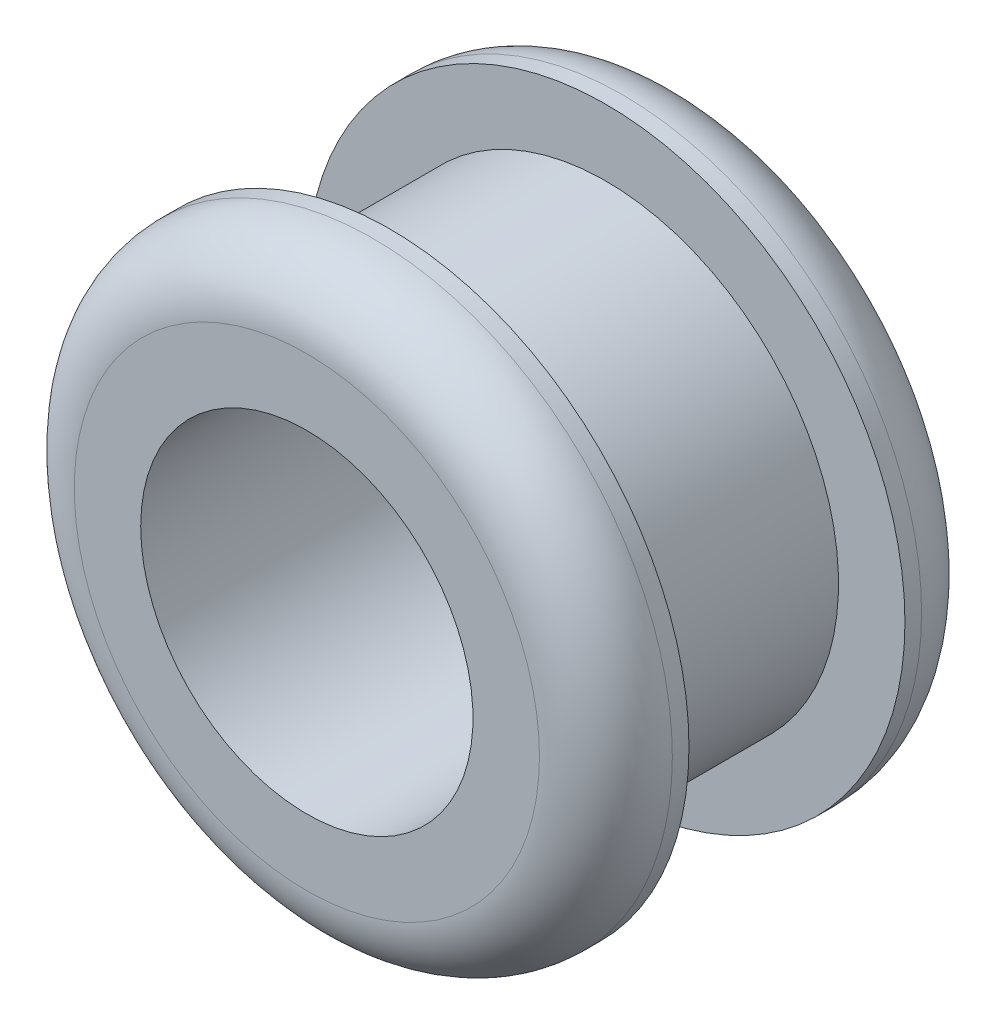
ISO-10303-21;
HEADER;
FILE_DESCRIPTION(('STEP AP214'),'2;1');
FILE_NAME('part.step','',(''),(''),'','','');
FILE_SCHEMA(('AUTOMOTIVE_DESIGN { 1 0 10303 214 1 1 1 1 }'));
ENDSEC;
DATA;
#1=APPLICATION_CONTEXT('core data for automotive mechanical design processes');
#2=APPLICATION_PROTOCOL_DEFINITION('international standard','automotive_design',2000,#1);
#3=PRODUCT_CONTEXT('',#1,'mechanical');
#4=PRODUCT('Part','Part','',(#3));
#5=PRODUCT_RELATED_PRODUCT_CATEGORY('part','',(#4));
#6=PRODUCT_DEFINITION_FORMATION('','',#4);
#7=PRODUCT_DEFINITION_CONTEXT('part definition',#1,'design');
#8=PRODUCT_DEFINITION('design','',#6,#7);
#9=PRODUCT_DEFINITION_SHAPE('','',#8);
#10=(LENGTH_UNIT() NAMED_UNIT(*) SI_UNIT(.MILLI.,.METRE.));
#11=(NAMED_UNIT(*) PLANE_ANGLE_UNIT() SI_UNIT($,.RADIAN.));
#12=(NAMED_UNIT(*) SI_UNIT($,.STERADIAN.) SOLID_ANGLE_UNIT());
#13=UNCERTAINTY_MEASURE_WITH_UNIT(LENGTH_MEASURE(1.E-05),#10,'distance_accuracy_value','');
#14=(GEOMETRIC_REPRESENTATION_CONTEXT(3) GLOBAL_UNCERTAINTY_ASSIGNED_CONTEXT((#13)) GLOBAL_UNIT_ASSIGNED_CONTEXT((#10,
#11,#12)) REPRESENTATION_CONTEXT('',''));
#15=CARTESIAN_POINT('',(0.,0.,0.));
#16=DIRECTION('',(0.,0.,1.));
#17=DIRECTION('',(1.,0.,0.));
#18=AXIS2_PLACEMENT_3D('',#15,#16,#17);
#19=CARTESIAN_POINT('',(0.,0.,3.25));
#20=DIRECTION('',(0.,0.,-1.));
#21=DIRECTION('',(-1.,0.,0.));
#22=AXIS2_PLACEMENT_3D('',#19,#20,#21);
#23=CYLINDRICAL_SURFACE('',#22,7.);
#24=CARTESIAN_POINT('',(0.,0.,3.25));
#25=DIRECTION('',(0.,0.,1.));
#26=DIRECTION('',(1.,0.,0.));
#27=AXIS2_PLACEMENT_3D('',#24,#25,#26);
#28=CIRCLE('',#27,7.);
#29=CARTESIAN_POINT('',(-7.,0.,3.25));
#30=VERTEX_POINT('',#29);
#31=EDGE_CURVE('E55',#30,#30,#28,.T.);
#32=CARTESIAN_POINT('',(0.,0.,-3.25));
#33=DIRECTION('',(0.,0.,1.));
#34=DIRECTION('',(1.,0.,0.));
#35=AXIS2_PLACEMENT_3D('',#32,#33,#34);
#36=CIRCLE('',#35,7.);
#37=CARTESIAN_POINT('',(-7.,0.,-3.25));
#38=VERTEX_POINT('',#37);
#39=EDGE_CURVE('E56',#38,#38,#36,.T.);
#40=CARTESIAN_POINT('',(-7.,0.,3.25));
#41=CARTESIAN_POINT('',(-7.,0.,3.18229166666667));
#42=CARTESIAN_POINT('',(-7.,0.,3.11458333333333));
#43=CARTESIAN_POINT('',(-7.,0.,2.97916666666667));
#44=CARTESIAN_POINT('',(-7.,0.,2.91145833333333));
#45=CARTESIAN_POINT('',(-7.,0.,2.77604166666667));
#46=CARTESIAN_POINT('',(-7.,0.,2.70833333333333));
#47=CARTESIAN_POINT('',(-7.,0.,2.57291666666667));
#48=CARTESIAN_POINT('',(-7.,0.,2.50520833333333));
#49=CARTESIAN_POINT('',(-7.,0.,2.36979166666667));
#50=CARTESIAN_POINT('',(-7.,0.,2.30208333333333));
#51=CARTESIAN_POINT('',(-7.,0.,2.16666666666667));
#52=CARTESIAN_POINT('',(-7.,0.,2.09895833333333));
#53=CARTESIAN_POINT('',(-7.,0.,1.96354166666667));
#54=CARTESIAN_POINT('',(-7.,0.,1.89583333333333));
#55=CARTESIAN_POINT('',(-7.,0.,1.76041666666667));
#56=CARTESIAN_POINT('',(-7.,0.,1.69270833333333));
#57=CARTESIAN_POINT('',(-7.,0.,1.55729166666667));
#58=CARTESIAN_POINT('',(-7.,0.,1.48958333333333));
#59=CARTESIAN_POINT('',(-7.,0.,1.35416666666667));
#60=CARTESIAN_POINT('',(-7.,0.,1.28645833333333));
#61=CARTESIAN_POINT('',(-7.,0.,1.15104166666667));
#62=CARTESIAN_POINT('',(-7.,0.,1.08333333333333));
#63=CARTESIAN_POINT('',(-7.,0.,0.947916666666667));
#64=CARTESIAN_POINT('',(-7.,0.,0.880208333333333));
#65=CARTESIAN_POINT('',(-7.,0.,0.744791666666667));
#66=CARTESIAN_POINT('',(-7.,0.,0.677083333333333));
#67=CARTESIAN_POINT('',(-7.,0.,0.541666666666667));
#68=CARTESIAN_POINT('',(-7.,0.,0.473958333333333));
#69=CARTESIAN_POINT('',(-7.,0.,0.338541666666667));
#70=CARTESIAN_POINT('',(-7.,0.,0.270833333333333));
#71=CARTESIAN_POINT('',(-7.,0.,0.135416666666667));
#72=CARTESIAN_POINT('',(-7.,0.,0.0677083333333334));
#73=CARTESIAN_POINT('',(-7.,0.,-0.0677083333333334));
#74=CARTESIAN_POINT('',(-7.,0.,-0.135416666666667));
#75=CARTESIAN_POINT('',(-7.,0.,-0.270833333333333));
#76=CARTESIAN_POINT('',(-7.,0.,-0.338541666666667));
#77=CARTESIAN_POINT('',(-7.,0.,-0.473958333333333));
#78=CARTESIAN_POINT('',(-7.,0.,-0.541666666666667));
#79=CARTESIAN_POINT('',(-7.,0.,-0.677083333333333));
#80=CARTESIAN_POINT('',(-7.,0.,-0.744791666666666));
#81=CARTESIAN_POINT('',(-7.,0.,-0.880208333333333));
#82=CARTESIAN_POINT('',(-7.,0.,-0.947916666666666));
#83=CARTESIAN_POINT('',(-7.,0.,-1.08333333333333));
#84=CARTESIAN_POINT('',(-7.,0.,-1.15104166666667));
#85=CARTESIAN_POINT('',(-7.,0.,-1.28645833333333));
#86=CARTESIAN_POINT('',(-7.,0.,-1.35416666666667));
#87=CARTESIAN_POINT('',(-7.,0.,-1.48958333333333));
#88=CARTESIAN_POINT('',(-7.,0.,-1.55729166666667));
#89=CARTESIAN_POINT('',(-7.,0.,-1.69270833333333));
#90=CARTESIAN_POINT('',(-7.,0.,-1.76041666666667));
#91=CARTESIAN_POINT('',(-7.,0.,-1.89583333333333));
#92=CARTESIAN_POINT('',(-7.,0.,-1.96354166666667));
#93=CARTESIAN_POINT('',(-7.,0.,-2.09895833333333));
#94=CARTESIAN_POINT('',(-7.,0.,-2.16666666666667));
#95=CARTESIAN_POINT('',(-7.,0.,-2.30208333333333));
#96=CARTESIAN_POINT('',(-7.,0.,-2.36979166666667));
#97=CARTESIAN_POINT('',(-7.,0.,-2.50520833333333));
#98=CARTESIAN_POINT('',(-7.,0.,-2.57291666666667));
#99=CARTESIAN_POINT('',(-7.,0.,-2.70833333333333));
#100=CARTESIAN_POINT('',(-7.,0.,-2.77604166666667));
#101=CARTESIAN_POINT('',(-7.,0.,-2.91145833333333));
#102=CARTESIAN_POINT('',(-7.,0.,-2.97916666666667));
#103=CARTESIAN_POINT('',(-7.,0.,-3.11458333333333));
#104=CARTESIAN_POINT('',(-7.,0.,-3.18229166666667));
#105=CARTESIAN_POINT('',(-7.,0.,-3.25));
#106=B_SPLINE_CURVE_WITH_KNOTS('',3,(#40,#41,#42,#43,#44,#45,#46,#47,#48,#49,#50,#51,#52,#53,
#54,#55,#56,#57,#58,#59,#60,#61,#62,#63,#64,#65,#66,#67,#68,#69,#70,#71,#72,#73,#74,#75,#76,#77,
#78,#79,#80,#81,#82,#83,#84,#85,#86,#87,#88,#89,#90,#91,#92,#93,#94,#95,#96,#97,#98,#99,#100,
#101,#102,#103,#104,#105),.UNSPECIFIED.,.F.,.F.,(4,2,2,2,2,2,2,2,2,2,2,2,2,2,2,2,2,2,2,2,2,2,2,
2,2,2,2,2,2,2,2,2,4),(0.,0.203125,0.40625,0.609375,0.8125,1.015625,1.21875,1.421875,1.625,
1.828125,2.03125,2.234375,2.4375,2.640625,2.84375,3.046875,3.25,3.453125,3.65625,3.859375,
4.0625,4.265625,4.46875,4.671875,4.875,5.078125,5.28125,5.484375,5.6875,5.890625,6.09375,
6.296875,6.5),.UNSPECIFIED.);
#107=EDGE_CURVE('BSEAM35',#30,#38,#106,.T.);
#108=ORIENTED_EDGE('',*,*,#31,.F.);
#109=ORIENTED_EDGE('',*,*,#39,.T.);
#110=ORIENTED_EDGE('',*,*,#107,.T.);
#111=ORIENTED_EDGE('',*,*,#107,.F.);
#112=EDGE_LOOP('',(#108,#110,#109,#111));
#113=FACE_BOUND('',#112,.T.);
#114=ADVANCED_FACE('F35',(#113),#23,.T.);
#115=CARTESIAN_POINT('',(0.,0.,3.25));
#116=DIRECTION('',(0.,0.,-1.));
#117=DIRECTION('',(-1.,0.,0.));
#118=AXIS2_PLACEMENT_3D('',#115,#116,#117);
#119=CYLINDRICAL_SURFACE('',#118,5.);
#120=CARTESIAN_POINT('',(0.,0.,5.75));
#121=DIRECTION('',(0.,0.,1.));
#122=DIRECTION('',(1.,0.,0.));
#123=AXIS2_PLACEMENT_3D('',#120,#121,#122);
#124=CIRCLE('',#123,5.);
#125=CARTESIAN_POINT('',(-5.,0.,5.75));
#126=VERTEX_POINT('',#125);
#127=EDGE_CURVE('E59',#126,#126,#124,.T.);
#128=CARTESIAN_POINT('',(0.,0.,-5.75));
#129=DIRECTION('',(0.,0.,1.));
#130=DIRECTION('',(1.,0.,0.));
#131=AXIS2_PLACEMENT_3D('',#128,#129,#130);
#132=CIRCLE('',#131,5.);
#133=CARTESIAN_POINT('',(-5.,0.,-5.75));
#134=VERTEX_POINT('',#133);
#135=EDGE_CURVE('E70',#134,#134,#132,.T.);
#136=CARTESIAN_POINT('',(-5.,0.,5.75));
#137=CARTESIAN_POINT('',(-5.,0.,5.63020833333333));
#138=CARTESIAN_POINT('',(-5.,0.,5.51041666666667));
#139=CARTESIAN_POINT('',(-5.,0.,5.27083333333333));
#140=CARTESIAN_POINT('',(-5.,0.,5.15104166666667));
#141=CARTESIAN_POINT('',(-5.,0.,4.91145833333333));
#142=CARTESIAN_POINT('',(-5.,0.,4.79166666666667));
#143=CARTESIAN_POINT('',(-5.,0.,4.55208333333333));
#144=CARTESIAN_POINT('',(-5.,0.,4.43229166666667));
#145=CARTESIAN_POINT('',(-5.,0.,4.19270833333333));
#146=CARTESIAN_POINT('',(-5.,0.,4.07291666666667));
#147=CARTESIAN_POINT('',(-5.,0.,3.83333333333333));
#148=CARTESIAN_POINT('',(-5.,0.,3.71354166666667));
#149=CARTESIAN_POINT('',(-5.,0.,3.47395833333333));
#150=CARTESIAN_POINT('',(-5.,0.,3.35416666666667));
#151=CARTESIAN_POINT('',(-5.,0.,3.11458333333333));
#152=CARTESIAN_POINT('',(-5.,0.,2.99479166666667));
#153=CARTESIAN_POINT('',(-5.,0.,2.75520833333333));
#154=CARTESIAN_POINT('',(-5.,0.,2.63541666666667));
#155=CARTESIAN_POINT('',(-5.,0.,2.39583333333333));
#156=CARTESIAN_POINT('',(-5.,0.,2.27604166666667));
#157=CARTESIAN_POINT('',(-5.,0.,2.03645833333333));
#158=CARTESIAN_POINT('',(-5.,0.,1.91666666666667));
#159=CARTESIAN_POINT('',(-5.,0.,1.67708333333333));
#160=CARTESIAN_POINT('',(-5.,0.,1.55729166666667));
#161=CARTESIAN_POINT('',(-5.,0.,1.31770833333333));
#162=CARTESIAN_POINT('',(-5.,0.,1.19791666666667));
#163=CARTESIAN_POINT('',(-5.,0.,0.958333333333333));
#164=CARTESIAN_POINT('',(-5.,0.,0.838541666666667));
#165=CARTESIAN_POINT('',(-5.,0.,0.598958333333333));
#166=CARTESIAN_POINT('',(-5.,0.,0.479166666666667));
#167=CARTESIAN_POINT('',(-5.,0.,0.239583333333334));
#168=CARTESIAN_POINT('',(-5.,0.,0.119791666666667));
#169=CARTESIAN_POINT('',(-5.,0.,-0.119791666666667));
#170=CARTESIAN_POINT('',(-5.,0.,-0.239583333333334));
#171=CARTESIAN_POINT('',(-5.,0.,-0.479166666666667));
#172=CARTESIAN_POINT('',(-5.,0.,-0.598958333333333));
#173=CARTESIAN_POINT('',(-5.,0.,-0.838541666666666));
#174=CARTESIAN_POINT('',(-5.,0.,-0.958333333333333));
#175=CARTESIAN_POINT('',(-5.,0.,-1.19791666666667));
#176=CARTESIAN_POINT('',(-5.,0.,-1.31770833333333));
#177=CARTESIAN_POINT('',(-5.,0.,-1.55729166666667));
#178=CARTESIAN_POINT('',(-5.,0.,-1.67708333333333));
#179=CARTESIAN_POINT('',(-5.,0.,-1.91666666666667));
#180=CARTESIAN_POINT('',(-5.,0.,-2.03645833333333));
#181=CARTESIAN_POINT('',(-5.,0.,-2.27604166666667));
#182=CARTESIAN_POINT('',(-5.,0.,-2.39583333333333));
#183=CARTESIAN_POINT('',(-5.,0.,-2.63541666666667));
#184=CARTESIAN_POINT('',(-5.,0.,-2.75520833333333));
#185=CARTESIAN_POINT('',(-5.,0.,-2.99479166666667));
#186=CARTESIAN_POINT('',(-5.,0.,-3.11458333333333));
#187=CARTESIAN_POINT('',(-5.,0.,-3.35416666666667));
#188=CARTESIAN_POINT('',(-5.,0.,-3.47395833333333));
#189=CARTESIAN_POINT('',(-5.,0.,-3.71354166666667));
#190=CARTESIAN_POINT('',(-5.,0.,-3.83333333333333));
#191=CARTESIAN_POINT('',(-5.,0.,-4.07291666666667));
#192=CARTESIAN_POINT('',(-5.,0.,-4.19270833333333));
#193=CARTESIAN_POINT('',(-5.,0.,-4.43229166666667));
#194=CARTESIAN_POINT('',(-5.,0.,-4.55208333333333));
#195=CARTESIAN_POINT('',(-5.,0.,-4.79166666666667));
#196=CARTESIAN_POINT('',(-5.,0.,-4.91145833333333));
#197=CARTESIAN_POINT('',(-5.,0.,-5.15104166666667));
#198=CARTESIAN_POINT('',(-5.,0.,-5.27083333333333));
#199=CARTESIAN_POINT('',(-5.,0.,-5.51041666666667));
#200=CARTESIAN_POINT('',(-5.,0.,-5.63020833333333));
#201=CARTESIAN_POINT('',(-5.,0.,-5.75));
#202=B_SPLINE_CURVE_WITH_KNOTS('',3,(#136,#137,#138,#139,#140,#141,#142,#143,#144,#145,#146,
#147,#148,#149,#150,#151,#152,#153,#154,#155,#156,#157,#158,#159,#160,#161,#162,#163,#164,#165,
#166,#167,#168,#169,#170,#171,#172,#173,#174,#175,#176,#177,#178,#179,#180,#181,#182,#183,#184,
#185,#186,#187,#188,#189,#190,#191,#192,#193,#194,#195,#196,#197,#198,#199,#200,#201),
.UNSPECIFIED.,.F.,.F.,(4,2,2,2,2,2,2,2,2,2,2,2,2,2,2,2,2,2,2,2,2,2,2,2,2,2,2,2,2,2,2,2,4),(0.,
0.359374999999999,0.71875,1.078125,1.4375,1.796875,2.15625,2.515625,2.875,3.234375,3.59375,
3.953125,4.3125,4.671875,5.03125,5.390625,5.75,6.109375,6.46875,6.828125,7.1875,7.546875,
7.90625,8.265625,8.625,8.984375,9.34375,9.703125,10.0625,10.421875,10.78125,11.140625,11.5),.UNSPECIFIED.);
#203=EDGE_CURVE('BSEAM76',#126,#134,#202,.T.);
#204=ORIENTED_EDGE('',*,*,#127,.T.);
#205=ORIENTED_EDGE('',*,*,#135,.F.);
#206=ORIENTED_EDGE('',*,*,#203,.T.);
#207=ORIENTED_EDGE('',*,*,#203,.F.);
#208=EDGE_LOOP('',(#204,#206,#205,#207));
#209=FACE_BOUND('',#208,.T.);
#210=ADVANCED_FACE('F76',(#209),#119,.F.);
#211=CARTESIAN_POINT('',(0.,0.,5.75));
#212=DIRECTION('',(0.,0.,1.));
#213=DIRECTION('',(1.,0.,0.));
#214=AXIS2_PLACEMENT_3D('',#211,#212,#213);
#215=PLANE('',#214);
#216=CARTESIAN_POINT('',(0.,0.,5.75));
#217=DIRECTION('',(0.,0.,1.));
#218=DIRECTION('',(1.,0.,0.));
#219=AXIS2_PLACEMENT_3D('',#216,#217,#218);
#220=CIRCLE('',#219,7.);
#221=CARTESIAN_POINT('',(7.,0.,5.75));
#222=VERTEX_POINT('',#221);
#223=EDGE_CURVE('E50',#222,#222,#220,.T.);
#224=ORIENTED_EDGE('',*,*,#223,.T.);
#225=EDGE_LOOP('',(#224));
#226=FACE_BOUND('',#225,.T.);
#227=ORIENTED_EDGE('',*,*,#127,.F.);
#228=EDGE_LOOP('',(#227));
#229=FACE_BOUND('',#228,.T.);
#230=ADVANCED_FACE('F78',(#226,#229),#215,.T.);
#231=CARTESIAN_POINT('',(0.,0.,3.25));
#232=DIRECTION('',(0.,0.,1.));
#233=DIRECTION('',(1.,0.,0.));
#234=AXIS2_PLACEMENT_3D('',#231,#232,#233);
#235=PLANE('',#234);
#236=ORIENTED_EDGE('',*,*,#31,.T.);
#237=EDGE_LOOP('',(#236));
#238=FACE_BOUND('',#237,.T.);
#239=CARTESIAN_POINT('',(0.,0.,3.25));
#240=DIRECTION('',(0.,0.,1.));
#241=DIRECTION('',(1.,0.,0.));
#242=AXIS2_PLACEMENT_3D('',#239,#240,#241);
#243=CIRCLE('',#242,9.);
#244=CARTESIAN_POINT('',(9.,0.,3.25));
#245=VERTEX_POINT('',#244);
#246=EDGE_CURVE('E63',#245,#245,#243,.T.);
#247=ORIENTED_EDGE('',*,*,#246,.F.);
#248=EDGE_LOOP('',(#247));
#249=FACE_BOUND('',#248,.T.);
#250=ADVANCED_FACE('F85',(#238,#249),#235,.F.);
#251=CARTESIAN_POINT('',(0.,0.,5.75));
#252=DIRECTION('',(0.,0.,-1.));
#253=DIRECTION('',(-1.,0.,0.));
#254=AXIS2_PLACEMENT_3D('',#251,#252,#253);
#255=CYLINDRICAL_SURFACE('',#254,9.);
#256=CARTESIAN_POINT('',(0.,0.,3.75));
#257=DIRECTION('',(0.,0.,1.));
#258=DIRECTION('',(1.,0.,0.));
#259=AXIS2_PLACEMENT_3D('',#256,#257,#258);
#260=CIRCLE('',#259,9.);
#261=CARTESIAN_POINT('',(9.,0.,3.75));
#262=VERTEX_POINT('',#261);
#263=EDGE_CURVE('E46',#262,#262,#260,.F.);
#264=ORIENTED_EDGE('',*,*,#263,.T.);
#265=EDGE_LOOP('',(#264));
#266=FACE_BOUND('',#265,.T.);
#267=ORIENTED_EDGE('',*,*,#246,.T.);
#268=EDGE_LOOP('',(#267));
#269=FACE_BOUND('',#268,.T.);
#270=ADVANCED_FACE('F91',(#266,#269),#255,.T.);
#271=CARTESIAN_POINT('',(0.,0.,3.75));
#272=DIRECTION('',(0.,0.,1.));
#273=DIRECTION('',(1.,0.,0.));
#274=AXIS2_PLACEMENT_3D('',#271,#272,#273);
#275=TOROIDAL_SURFACE('',#274,7.,2.);
#276=ORIENTED_EDGE('',*,*,#263,.F.);
#277=EDGE_LOOP('',(#276));
#278=FACE_BOUND('',#277,.T.);
#279=ORIENTED_EDGE('',*,*,#223,.F.);
#280=EDGE_LOOP('',(#279));
#281=FACE_BOUND('',#280,.T.);
#282=ADVANCED_FACE('F93',(#278,#281),#275,.T.);
#283=CARTESIAN_POINT('',(0.,0.,-5.75));
#284=DIRECTION('',(0.,0.,1.));
#285=DIRECTION('',(1.,0.,0.));
#286=AXIS2_PLACEMENT_3D('',#283,#284,#285);
#287=CYLINDRICAL_SURFACE('',#286,9.);
#288=CARTESIAN_POINT('',(0.,0.,-3.75));
#289=DIRECTION('',(0.,0.,-1.));
#290=DIRECTION('',(-1.,0.,0.));
#291=AXIS2_PLACEMENT_3D('',#288,#289,#290);
#292=CIRCLE('',#291,9.);
#293=CARTESIAN_POINT('',(-9.,0.,-3.75));
#294=VERTEX_POINT('',#293);
#295=EDGE_CURVE('E42',#294,#294,#292,.F.);
#296=ORIENTED_EDGE('',*,*,#295,.T.);
#297=EDGE_LOOP('',(#296));
#298=FACE_BOUND('',#297,.T.);
#299=CARTESIAN_POINT('',(0.,0.,-3.25));
#300=DIRECTION('',(0.,0.,1.));
#301=DIRECTION('',(1.,0.,0.));
#302=AXIS2_PLACEMENT_3D('',#299,#300,#301);
#303=CIRCLE('',#302,9.);
#304=CARTESIAN_POINT('',(9.,0.,-3.25));
#305=VERTEX_POINT('',#304);
#306=EDGE_CURVE('E60',#305,#305,#303,.T.);
#307=ORIENTED_EDGE('',*,*,#306,.F.);
#308=EDGE_LOOP('',(#307));
#309=FACE_BOUND('',#308,.T.);
#310=ADVANCED_FACE('F95',(#298,#309),#287,.T.);
#311=CARTESIAN_POINT('',(0.,0.,-5.75));
#312=DIRECTION('',(0.,0.,-1.));
#313=DIRECTION('',(1.,0.,0.));
#314=AXIS2_PLACEMENT_3D('',#311,#312,#313);
#315=PLANE('',#314);
#316=CARTESIAN_POINT('',(0.,0.,-5.75));
#317=DIRECTION('',(0.,0.,-1.));
#318=DIRECTION('',(-1.,0.,0.));
#319=AXIS2_PLACEMENT_3D('',#316,#317,#318);
#320=CIRCLE('',#319,7.);
#321=CARTESIAN_POINT('',(-7.,0.,-5.75));
#322=VERTEX_POINT('',#321);
#323=EDGE_CURVE('E10',#322,#322,#320,.T.);
#324=ORIENTED_EDGE('',*,*,#323,.T.);
#325=EDGE_LOOP('',(#324));
#326=FACE_BOUND('',#325,.T.);
#327=ORIENTED_EDGE('',*,*,#135,.T.);
#328=EDGE_LOOP('',(#327));
#329=FACE_BOUND('',#328,.T.);
#330=ADVANCED_FACE('F74',(#326,#329),#315,.T.);
#331=CARTESIAN_POINT('',(0.,0.,-3.25));
#332=DIRECTION('',(0.,0.,-1.));
#333=DIRECTION('',(1.,0.,0.));
#334=AXIS2_PLACEMENT_3D('',#331,#332,#333);
#335=PLANE('',#334);
#336=ORIENTED_EDGE('',*,*,#39,.F.);
#337=EDGE_LOOP('',(#336));
#338=FACE_BOUND('',#337,.T.);
#339=ORIENTED_EDGE('',*,*,#306,.T.);
#340=EDGE_LOOP('',(#339));
#341=FACE_BOUND('',#340,.T.);
#342=ADVANCED_FACE('F116',(#338,#341),#335,.F.);
#343=CARTESIAN_POINT('',(0.,0.,-3.75));
#344=DIRECTION('',(0.,0.,-1.));
#345=DIRECTION('',(-1.,0.,0.));
#346=AXIS2_PLACEMENT_3D('',#343,#344,#345);
#347=TOROIDAL_SURFACE('',#346,7.,2.);
#348=ORIENTED_EDGE('',*,*,#323,.F.);
#349=EDGE_LOOP('',(#348));
#350=FACE_BOUND('',#349,.T.);
#351=ORIENTED_EDGE('',*,*,#295,.F.);
#352=EDGE_LOOP('',(#351));
#353=FACE_BOUND('',#352,.T.);
#354=ADVANCED_FACE('F37',(#350,#353),#347,.T.);
#355=CLOSED_SHELL('',(#114,#210,#230,#250,#270,#282,#310,#330,#342,#354));
#356=MANIFOLD_SOLID_BREP('B2',#355);
#357=ADVANCED_BREP_SHAPE_REPRESENTATION('',(#18,#356),#14);
#358=SHAPE_DEFINITION_REPRESENTATION(#9,#357);
ENDSEC;
END-ISO-10303-21;
